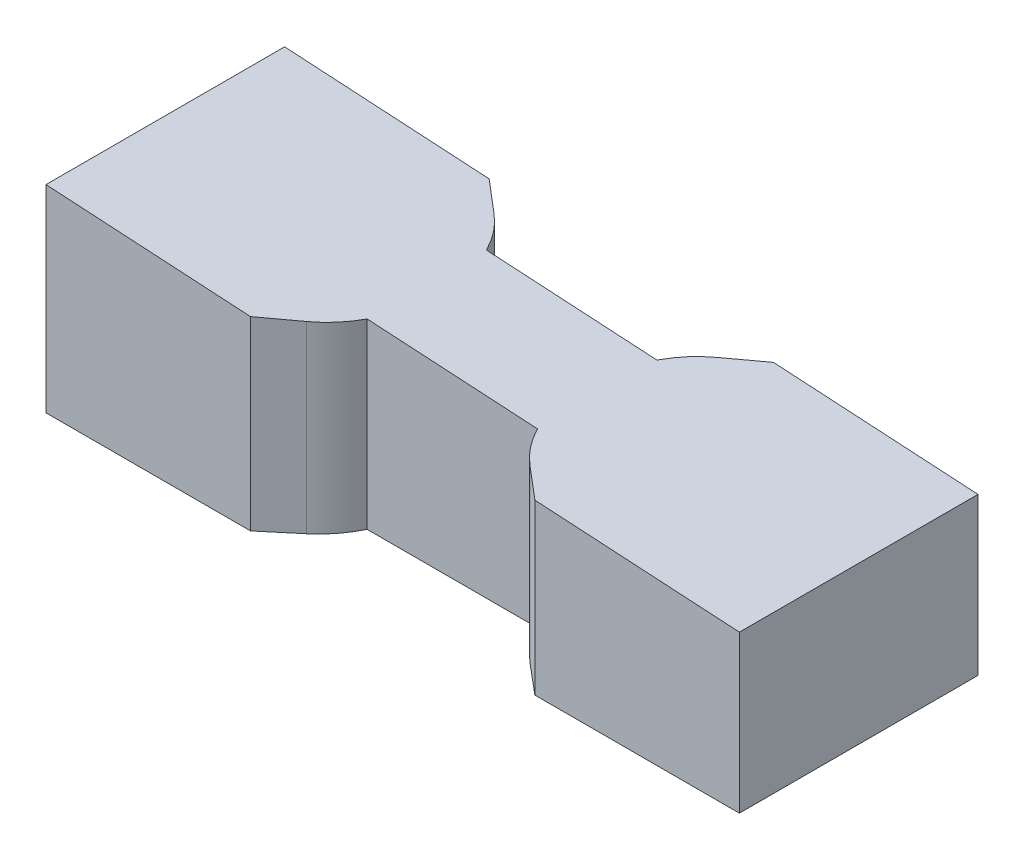
ISO-10303-21;
HEADER;
FILE_DESCRIPTION(('STEP AP214'),'2;1');
FILE_NAME('part.step','',(''),(''),'','','');
FILE_SCHEMA(('AUTOMOTIVE_DESIGN { 1 0 10303 214 1 1 1 1 }'));
ENDSEC;
DATA;
#1=APPLICATION_CONTEXT('core data for automotive mechanical design processes');
#2=APPLICATION_PROTOCOL_DEFINITION('international standard','automotive_design',2000,#1);
#3=PRODUCT_CONTEXT('',#1,'mechanical');
#4=PRODUCT('Part','Part','',(#3));
#5=PRODUCT_RELATED_PRODUCT_CATEGORY('part','',(#4));
#6=PRODUCT_DEFINITION_FORMATION('','',#4);
#7=PRODUCT_DEFINITION_CONTEXT('part definition',#1,'design');
#8=PRODUCT_DEFINITION('design','',#6,#7);
#9=PRODUCT_DEFINITION_SHAPE('','',#8);
#10=(LENGTH_UNIT() NAMED_UNIT(*) SI_UNIT(.MILLI.,.METRE.));
#11=(NAMED_UNIT(*) PLANE_ANGLE_UNIT() SI_UNIT($,.RADIAN.));
#12=(NAMED_UNIT(*) SI_UNIT($,.STERADIAN.) SOLID_ANGLE_UNIT());
#13=UNCERTAINTY_MEASURE_WITH_UNIT(LENGTH_MEASURE(1.E-05),#10,'distance_accuracy_value','');
#14=(GEOMETRIC_REPRESENTATION_CONTEXT(3) GLOBAL_UNCERTAINTY_ASSIGNED_CONTEXT((#13)) GLOBAL_UNIT_ASSIGNED_CONTEXT((#10,
#11,#12)) REPRESENTATION_CONTEXT('',''));
#15=CARTESIAN_POINT('',(0.,0.,0.));
#16=DIRECTION('',(0.,0.,1.));
#17=DIRECTION('',(1.,0.,0.));
#18=AXIS2_PLACEMENT_3D('',#15,#16,#17);
#19=CARTESIAN_POINT('',(-5.20386382712178,20.4591771710695,-0.450338350037831));
#20=DIRECTION('',(0.,-1.,0.));
#21=DIRECTION('',(0.,0.,-1.));
#22=AXIS2_PLACEMENT_3D('',#19,#20,#21);
#23=CYLINDRICAL_SURFACE('',#22,3.00000000000001);
#24=DIRECTION('',(0.,-1.,0.));
#25=VECTOR('',#24,1.);
#26=CARTESIAN_POINT('',(-3.27550099806217,8.,-2.74847167939477));
#27=LINE('',#26,#25);
#28=CARTESIAN_POINT('',(-3.27550099806215,5.3932232834846,-2.74847167939475));
#29=VERTEX_POINT('',#28);
#30=CARTESIAN_POINT('',(-3.27550099806215,0.,-2.74847167939476));
#31=VERTEX_POINT('',#30);
#32=EDGE_CURVE('E179',#29,#31,#27,.T.);
#33=ORIENTED_EDGE('',*,*,#32,.F.);
#34=CARTESIAN_POINT('',(-5.20386382712178,5.50697827785065,-0.450338350037831));
#35=DIRECTION('',(-0.0588880791734356,-0.998264591243856,0.));
#36=DIRECTION('',(0.998264591243856,-0.0588880791734356,0.));
#37=AXIS2_PLACEMENT_3D('',#34,#35,#36);
#38=ELLIPSE('',#37,3.00521527690564,3.00000000000001);
#39=CARTESIAN_POINT('',(-2.5,5.3474761292997,-1.75));
#40=VERTEX_POINT('',#39);
#41=EDGE_CURVE('E454',#29,#40,#38,.T.);
#42=ORIENTED_EDGE('',*,*,#41,.T.);
#43=DIRECTION('',(0.,-1.,0.));
#44=VECTOR('',#43,1.);
#45=CARTESIAN_POINT('',(-2.5,20.4591771710695,-1.75));
#46=LINE('',#45,#44);
#47=CARTESIAN_POINT('',(-2.5,0.,-1.75));
#48=VERTEX_POINT('',#47);
#49=EDGE_CURVE('E192',#40,#48,#46,.T.);
#50=ORIENTED_EDGE('',*,*,#49,.T.);
#51=CARTESIAN_POINT('',(-5.20386382712178,0.,-0.450338350037831));
#52=DIRECTION('',(0.,1.,0.));
#53=DIRECTION('',(0.,0.,1.));
#54=AXIS2_PLACEMENT_3D('',#51,#52,#53);
#55=CIRCLE('',#54,3.00000000000001);
#56=EDGE_CURVE('E181',#48,#31,#55,.T.);
#57=ORIENTED_EDGE('',*,*,#56,.T.);
#58=EDGE_LOOP('',(#33,#42,#50,#57));
#59=FACE_BOUND('',#58,.T.);
#60=ADVANCED_FACE('F36',(#59),#23,.T.);
#61=CARTESIAN_POINT('',(4.17113757407974,8.,-3.5));
#62=DIRECTION('',(0.,0.,1.));
#63=DIRECTION('',(1.,0.,0.));
#64=AXIS2_PLACEMENT_3D('',#61,#62,#63);
#65=PLANE('',#64);
#66=DIRECTION('',(0.,-1.,0.));
#67=VECTOR('',#66,1.);
#68=CARTESIAN_POINT('',(4.17113757407974,8.,-3.5));
#69=LINE('',#68,#67);
#70=CARTESIAN_POINT('',(4.17113757407974,4.95394271031928,-3.5));
#71=VERTEX_POINT('',#70);
#72=CARTESIAN_POINT('',(4.17113757407974,0.,-3.5));
#73=VERTEX_POINT('',#72);
#74=EDGE_CURVE('E44',#71,#73,#69,.T.);
#75=ORIENTED_EDGE('',*,*,#74,.F.);
#76=DIRECTION('',(0.998264591243856,-0.0588880791734356,0.));
#77=VECTOR('',#76,1.);
#78=CARTESIAN_POINT('',(10.1711375740797,4.6,-3.5));
#79=LINE('',#78,#77);
#80=CARTESIAN_POINT('',(10.1711375740797,4.6,-3.5));
#81=VERTEX_POINT('',#80);
#82=EDGE_CURVE('E164',#71,#81,#79,.T.);
#83=ORIENTED_EDGE('',*,*,#82,.T.);
#84=DIRECTION('',(0.,-1.,0.));
#85=VECTOR('',#84,1.);
#86=CARTESIAN_POINT('',(10.1711375740797,8.,-3.5));
#87=LINE('',#86,#85);
#88=CARTESIAN_POINT('',(10.1711375740797,0.,-3.5));
#89=VERTEX_POINT('',#88);
#90=EDGE_CURVE('E217',#81,#89,#87,.T.);
#91=ORIENTED_EDGE('',*,*,#90,.T.);
#92=DIRECTION('',(-1.,0.,0.));
#93=VECTOR('',#92,1.);
#94=CARTESIAN_POINT('',(4.17113757407974,0.,-3.5));
#95=LINE('',#94,#93);
#96=EDGE_CURVE('E196',#89,#73,#95,.T.);
#97=ORIENTED_EDGE('',*,*,#96,.T.);
#98=EDGE_LOOP('',(#75,#83,#91,#97));
#99=FACE_BOUND('',#98,.T.);
#100=ADVANCED_FACE('F38',(#99),#65,.F.);
#101=CARTESIAN_POINT('',(3.27550099806217,8.,-2.74847167939477));
#102=DIRECTION('',(0.642787609686541,0.,0.766044443118977));
#103=DIRECTION('',(0.766044443118977,0.,-0.642787609686541));
#104=AXIS2_PLACEMENT_3D('',#101,#102,#103);
#105=PLANE('',#104);
#106=DIRECTION('',(0.,-1.,0.));
#107=VECTOR('',#106,1.);
#108=CARTESIAN_POINT('',(3.27550099806217,8.,-2.74847167939477));
#109=LINE('',#108,#107);
#110=CARTESIAN_POINT('',(3.27550099806217,5.0067767165154,-2.74847167939477));
#111=VERTEX_POINT('',#110);
#112=CARTESIAN_POINT('',(3.27550099806217,0.,-2.74847167939477));
#113=VERTEX_POINT('',#112);
#114=EDGE_CURVE('E229',#111,#113,#109,.T.);
#115=ORIENTED_EDGE('',*,*,#114,.F.);
#116=DIRECTION('',(0.765263479463064,-0.0451432383382526,-0.642132303370902));
#117=VECTOR('',#116,1.);
#118=CARTESIAN_POINT('',(3.17209569477223,5.0128766420667,-2.66170432754241));
#119=LINE('',#118,#117);
#120=EDGE_CURVE('E237',#111,#71,#119,.T.);
#121=ORIENTED_EDGE('',*,*,#120,.T.);
#122=ORIENTED_EDGE('',*,*,#74,.T.);
#123=DIRECTION('',(-0.766044443118977,0.,0.642787609686541));
#124=VECTOR('',#123,1.);
#125=CARTESIAN_POINT('',(3.27550099806217,0.,-2.74847167939477));
#126=LINE('',#125,#124);
#127=EDGE_CURVE('E199',#73,#113,#126,.T.);
#128=ORIENTED_EDGE('',*,*,#127,.T.);
#129=EDGE_LOOP('',(#115,#121,#122,#128));
#130=FACE_BOUND('',#129,.T.);
#131=ADVANCED_FACE('F235',(#130),#105,.F.);
#132=CARTESIAN_POINT('',(5.20386382712179,8.,-0.450338350037831));
#133=DIRECTION('',(0.,-1.,0.));
#134=DIRECTION('',(0.,0.,-1.));
#135=AXIS2_PLACEMENT_3D('',#132,#133,#134);
#136=CYLINDRICAL_SURFACE('',#135,3.00000000000001);
#137=DIRECTION('',(0.,-1.,0.));
#138=VECTOR('',#137,1.);
#139=CARTESIAN_POINT('',(2.5,8.,-1.75));
#140=LINE('',#139,#138);
#141=CARTESIAN_POINT('',(2.5,5.0525238707003,-1.75));
#142=VERTEX_POINT('',#141);
#143=CARTESIAN_POINT('',(2.5,0.,-1.75));
#144=VERTEX_POINT('',#143);
#145=EDGE_CURVE('E227',#142,#144,#140,.T.);
#146=ORIENTED_EDGE('',*,*,#145,.F.);
#147=CARTESIAN_POINT('',(5.20386382712179,4.89302172214935,-0.450338350037831));
#148=DIRECTION('',(-0.0588880791734356,-0.998264591243856,0.));
#149=DIRECTION('',(0.998264591243856,-0.0588880791734356,0.));
#150=AXIS2_PLACEMENT_3D('',#147,#148,#149);
#151=ELLIPSE('',#150,3.00521527690564,3.00000000000001);
#152=EDGE_CURVE('E448',#142,#111,#151,.T.);
#153=ORIENTED_EDGE('',*,*,#152,.T.);
#154=ORIENTED_EDGE('',*,*,#114,.T.);
#155=CARTESIAN_POINT('',(5.20386382712179,0.,-0.450338350037831));
#156=DIRECTION('',(0.,1.,0.));
#157=DIRECTION('',(0.,0.,1.));
#158=AXIS2_PLACEMENT_3D('',#155,#156,#157);
#159=CIRCLE('',#158,3.00000000000001);
#160=EDGE_CURVE('E202',#113,#144,#159,.T.);
#161=ORIENTED_EDGE('',*,*,#160,.T.);
#162=EDGE_LOOP('',(#146,#153,#154,#161));
#163=FACE_BOUND('',#162,.T.);
#164=ADVANCED_FACE('F305',(#163),#136,.T.);
#165=CARTESIAN_POINT('',(5.20386382712179,8.,0.450338350037832));
#166=DIRECTION('',(0.,-1.,0.));
#167=DIRECTION('',(0.,0.,-1.));
#168=AXIS2_PLACEMENT_3D('',#165,#166,#167);
#169=CYLINDRICAL_SURFACE('',#168,3.00000000000001);
#170=DIRECTION('',(0.,-1.,0.));
#171=VECTOR('',#170,1.);
#172=CARTESIAN_POINT('',(3.27550099806217,8.,2.74847167939477));
#173=LINE('',#172,#171);
#174=CARTESIAN_POINT('',(3.27550099806217,5.0067767165154,2.74847167939477));
#175=VERTEX_POINT('',#174);
#176=CARTESIAN_POINT('',(3.27550099806217,0.,2.74847167939477));
#177=VERTEX_POINT('',#176);
#178=EDGE_CURVE('E223',#175,#177,#173,.T.);
#179=ORIENTED_EDGE('',*,*,#178,.F.);
#180=CARTESIAN_POINT('',(5.20386382712179,4.89302172214935,0.450338350037832));
#181=DIRECTION('',(-0.0588880791734356,-0.998264591243856,0.));
#182=DIRECTION('',(0.998264591243856,-0.0588880791734356,0.));
#183=AXIS2_PLACEMENT_3D('',#180,#181,#182);
#184=ELLIPSE('',#183,3.00521527690564,3.00000000000001);
#185=CARTESIAN_POINT('',(2.5,5.0525238707003,1.75));
#186=VERTEX_POINT('',#185);
#187=EDGE_CURVE('E461',#175,#186,#184,.T.);
#188=ORIENTED_EDGE('',*,*,#187,.T.);
#189=DIRECTION('',(0.,-1.,0.));
#190=VECTOR('',#189,1.);
#191=CARTESIAN_POINT('',(2.5,8.,1.75));
#192=LINE('',#191,#190);
#193=CARTESIAN_POINT('',(2.5,0.,1.75));
#194=VERTEX_POINT('',#193);
#195=EDGE_CURVE('E225',#186,#194,#192,.T.);
#196=ORIENTED_EDGE('',*,*,#195,.T.);
#197=CARTESIAN_POINT('',(5.20386382712179,0.,0.450338350037832));
#198=DIRECTION('',(0.,1.,0.));
#199=DIRECTION('',(0.,0.,-1.));
#200=AXIS2_PLACEMENT_3D('',#197,#198,#199);
#201=CIRCLE('',#200,3.00000000000001);
#202=EDGE_CURVE('E205',#194,#177,#201,.T.);
#203=ORIENTED_EDGE('',*,*,#202,.T.);
#204=EDGE_LOOP('',(#179,#188,#196,#203));
#205=FACE_BOUND('',#204,.T.);
#206=ADVANCED_FACE('F264',(#205),#169,.T.);
#207=CARTESIAN_POINT('',(3.27550099806217,8.,2.74847167939477));
#208=DIRECTION('',(0.642787609686541,0.,-0.766044443118976));
#209=DIRECTION('',(-0.766044443118977,0.,-0.642787609686541));
#210=AXIS2_PLACEMENT_3D('',#207,#208,#209);
#211=PLANE('',#210);
#212=DIRECTION('',(0.,-1.,0.));
#213=VECTOR('',#212,1.);
#214=CARTESIAN_POINT('',(4.17113757407974,8.,3.5));
#215=LINE('',#214,#213);
#216=CARTESIAN_POINT('',(4.17113757407974,4.95394271031928,3.5));
#217=VERTEX_POINT('',#216);
#218=CARTESIAN_POINT('',(4.17113757407974,0.,3.5));
#219=VERTEX_POINT('',#218);
#220=EDGE_CURVE('E221',#217,#219,#215,.T.);
#221=ORIENTED_EDGE('',*,*,#220,.F.);
#222=DIRECTION('',(-0.765263479463064,0.0451432383382526,-0.642132303370902));
#223=VECTOR('',#222,1.);
#224=CARTESIAN_POINT('',(3.17209569477223,5.0128766420667,2.66170432754241));
#225=LINE('',#224,#223);
#226=EDGE_CURVE('E261',#217,#175,#225,.T.);
#227=ORIENTED_EDGE('',*,*,#226,.T.);
#228=ORIENTED_EDGE('',*,*,#178,.T.);
#229=DIRECTION('',(0.766044443118976,0.,0.642787609686541));
#230=VECTOR('',#229,1.);
#231=CARTESIAN_POINT('',(3.27550099806217,0.,2.74847167939477));
#232=LINE('',#231,#230);
#233=EDGE_CURVE('E208',#177,#219,#232,.T.);
#234=ORIENTED_EDGE('',*,*,#233,.T.);
#235=EDGE_LOOP('',(#221,#227,#228,#234));
#236=FACE_BOUND('',#235,.T.);
#237=ADVANCED_FACE('F259',(#236),#211,.F.);
#238=CARTESIAN_POINT('',(4.17113757407974,8.,3.5));
#239=DIRECTION('',(0.,0.,-1.));
#240=DIRECTION('',(-1.,0.,0.));
#241=AXIS2_PLACEMENT_3D('',#238,#239,#240);
#242=PLANE('',#241);
#243=DIRECTION('',(0.,-1.,0.));
#244=VECTOR('',#243,1.);
#245=CARTESIAN_POINT('',(10.1711375740797,8.,3.5));
#246=LINE('',#245,#244);
#247=CARTESIAN_POINT('',(10.1711375740797,4.6,3.5));
#248=VERTEX_POINT('',#247);
#249=CARTESIAN_POINT('',(10.1711375740797,0.,3.5));
#250=VERTEX_POINT('',#249);
#251=EDGE_CURVE('E219',#248,#250,#246,.T.);
#252=ORIENTED_EDGE('',*,*,#251,.F.);
#253=DIRECTION('',(0.998264591243856,-0.0588880791734356,0.));
#254=VECTOR('',#253,1.);
#255=CARTESIAN_POINT('',(10.1711375740797,4.6,3.5));
#256=LINE('',#255,#254);
#257=EDGE_CURVE('E165',#217,#248,#256,.T.);
#258=ORIENTED_EDGE('',*,*,#257,.F.);
#259=ORIENTED_EDGE('',*,*,#220,.T.);
#260=DIRECTION('',(1.,0.,0.));
#261=VECTOR('',#260,1.);
#262=CARTESIAN_POINT('',(4.17113757407974,0.,3.5));
#263=LINE('',#262,#261);
#264=EDGE_CURVE('E211',#219,#250,#263,.T.);
#265=ORIENTED_EDGE('',*,*,#264,.T.);
#266=EDGE_LOOP('',(#252,#258,#259,#265));
#267=FACE_BOUND('',#266,.T.);
#268=ADVANCED_FACE('F254',(#267),#242,.F.);
#269=CARTESIAN_POINT('',(10.1711375740797,8.,-3.5));
#270=DIRECTION('',(-1.,0.,0.));
#271=DIRECTION('',(0.,0.,1.));
#272=AXIS2_PLACEMENT_3D('',#269,#270,#271);
#273=PLANE('',#272);
#274=ORIENTED_EDGE('',*,*,#90,.F.);
#275=DIRECTION('',(0.,0.,1.));
#276=VECTOR('',#275,1.);
#277=CARTESIAN_POINT('',(10.1711375740797,4.6,-3.5));
#278=LINE('',#277,#276);
#279=EDGE_CURVE('E155',#81,#248,#278,.T.);
#280=ORIENTED_EDGE('',*,*,#279,.T.);
#281=ORIENTED_EDGE('',*,*,#251,.T.);
#282=DIRECTION('',(0.,0.,-1.));
#283=VECTOR('',#282,1.);
#284=CARTESIAN_POINT('',(10.1711375740797,0.,-3.5));
#285=LINE('',#284,#283);
#286=EDGE_CURVE('E214',#250,#89,#285,.T.);
#287=ORIENTED_EDGE('',*,*,#286,.T.);
#288=EDGE_LOOP('',(#274,#280,#281,#287));
#289=FACE_BOUND('',#288,.T.);
#290=ADVANCED_FACE('F248',(#289),#273,.F.);
#291=CARTESIAN_POINT('',(5.20386382712179,0.,0.450338350037832));
#292=DIRECTION('',(0.,-1.,0.));
#293=DIRECTION('',(0.,0.,-1.));
#294=AXIS2_PLACEMENT_3D('',#291,#292,#293);
#295=PLANE('',#294);
#296=CARTESIAN_POINT('',(-5.20386382712178,0.,0.450338350037832));
#297=DIRECTION('',(0.,1.,0.));
#298=DIRECTION('',(0.,0.,-1.));
#299=AXIS2_PLACEMENT_3D('',#296,#297,#298);
#300=CIRCLE('',#299,3.00000000000001);
#301=CARTESIAN_POINT('',(-3.27550099806215,0.,2.74847167939476));
#302=VERTEX_POINT('',#301);
#303=CARTESIAN_POINT('',(-2.5,0.,1.75));
#304=VERTEX_POINT('',#303);
#305=EDGE_CURVE('E184',#302,#304,#300,.T.);
#306=ORIENTED_EDGE('',*,*,#305,.F.);
#307=DIRECTION('',(0.766044443118975,0.,-0.642787609686542));
#308=VECTOR('',#307,1.);
#309=CARTESIAN_POINT('',(-3.27550099806217,0.,2.74847167939477));
#310=LINE('',#309,#308);
#311=CARTESIAN_POINT('',(-4.17113757407974,0.,3.5));
#312=VERTEX_POINT('',#311);
#313=EDGE_CURVE('E435',#312,#302,#310,.T.);
#314=ORIENTED_EDGE('',*,*,#313,.F.);
#315=DIRECTION('',(1.,0.,0.));
#316=VECTOR('',#315,1.);
#317=CARTESIAN_POINT('',(-4.17113757407974,0.,3.5));
#318=LINE('',#317,#316);
#319=CARTESIAN_POINT('',(-10.1711375740797,0.,3.5));
#320=VERTEX_POINT('',#319);
#321=EDGE_CURVE('E436',#320,#312,#318,.T.);
#322=ORIENTED_EDGE('',*,*,#321,.F.);
#323=DIRECTION('',(0.,0.,1.));
#324=VECTOR('',#323,1.);
#325=CARTESIAN_POINT('',(-10.1711375740797,0.,-3.5));
#326=LINE('',#325,#324);
#327=CARTESIAN_POINT('',(-10.1711375740797,0.,-3.5));
#328=VERTEX_POINT('',#327);
#329=EDGE_CURVE('E169',#328,#320,#326,.T.);
#330=ORIENTED_EDGE('',*,*,#329,.F.);
#331=DIRECTION('',(-1.,0.,0.));
#332=VECTOR('',#331,1.);
#333=CARTESIAN_POINT('',(-4.17113757407974,0.,-3.5));
#334=LINE('',#333,#332);
#335=CARTESIAN_POINT('',(-4.17113757407974,0.,-3.5));
#336=VERTEX_POINT('',#335);
#337=EDGE_CURVE('E441',#336,#328,#334,.T.);
#338=ORIENTED_EDGE('',*,*,#337,.F.);
#339=DIRECTION('',(-0.766044443118976,0.,-0.642787609686542));
#340=VECTOR('',#339,1.);
#341=CARTESIAN_POINT('',(-3.27550099806217,0.,-2.74847167939477));
#342=LINE('',#341,#340);
#343=EDGE_CURVE('E444',#31,#336,#342,.T.);
#344=ORIENTED_EDGE('',*,*,#343,.F.);
#345=ORIENTED_EDGE('',*,*,#56,.F.);
#346=DIRECTION('',(-1.,0.,0.));
#347=VECTOR('',#346,1.);
#348=CARTESIAN_POINT('',(2.5,0.,-1.75));
#349=LINE('',#348,#347);
#350=EDGE_CURVE('E189',#144,#48,#349,.T.);
#351=ORIENTED_EDGE('',*,*,#350,.F.);
#352=ORIENTED_EDGE('',*,*,#160,.F.);
#353=ORIENTED_EDGE('',*,*,#127,.F.);
#354=ORIENTED_EDGE('',*,*,#96,.F.);
#355=ORIENTED_EDGE('',*,*,#286,.F.);
#356=ORIENTED_EDGE('',*,*,#264,.F.);
#357=ORIENTED_EDGE('',*,*,#233,.F.);
#358=ORIENTED_EDGE('',*,*,#202,.F.);
#359=DIRECTION('',(1.,0.,0.));
#360=VECTOR('',#359,1.);
#361=CARTESIAN_POINT('',(2.5,0.,1.75));
#362=LINE('',#361,#360);
#363=EDGE_CURVE('E186',#304,#194,#362,.T.);
#364=ORIENTED_EDGE('',*,*,#363,.F.);
#365=EDGE_LOOP('',(#306,#314,#322,#330,#338,#344,#345,#351,#352,#353,#354,#355,#356,#357,#358,#364));
#366=FACE_BOUND('',#365,.T.);
#367=ADVANCED_FACE('F242',(#366),#295,.T.);
#368=CARTESIAN_POINT('',(2.5,20.4591771710695,-1.75));
#369=DIRECTION('',(0.,0.,1.));
#370=DIRECTION('',(1.,0.,0.));
#371=AXIS2_PLACEMENT_3D('',#368,#369,#370);
#372=PLANE('',#371);
#373=ORIENTED_EDGE('',*,*,#49,.F.);
#374=DIRECTION('',(0.998264591243856,-0.0588880791734356,0.));
#375=VECTOR('',#374,1.);
#376=CARTESIAN_POINT('',(1.59430626186222,5.10595115343291,-1.75));
#377=LINE('',#376,#375);
#378=EDGE_CURVE('E451',#40,#142,#377,.T.);
#379=ORIENTED_EDGE('',*,*,#378,.T.);
#380=ORIENTED_EDGE('',*,*,#145,.T.);
#381=ORIENTED_EDGE('',*,*,#350,.T.);
#382=EDGE_LOOP('',(#373,#379,#380,#381));
#383=FACE_BOUND('',#382,.T.);
#384=ADVANCED_FACE('F285',(#383),#372,.F.);
#385=CARTESIAN_POINT('',(2.5,20.4591771710695,1.75));
#386=DIRECTION('',(0.,0.,-1.));
#387=DIRECTION('',(-1.,0.,0.));
#388=AXIS2_PLACEMENT_3D('',#385,#386,#387);
#389=PLANE('',#388);
#390=ORIENTED_EDGE('',*,*,#195,.F.);
#391=DIRECTION('',(-0.998264591243856,0.0588880791734356,0.));
#392=VECTOR('',#391,1.);
#393=CARTESIAN_POINT('',(1.59430626186222,5.10595115343291,1.75));
#394=LINE('',#393,#392);
#395=CARTESIAN_POINT('',(-2.5,5.3474761292997,1.75));
#396=VERTEX_POINT('',#395);
#397=EDGE_CURVE('E273',#186,#396,#394,.T.);
#398=ORIENTED_EDGE('',*,*,#397,.T.);
#399=DIRECTION('',(0.,-1.,0.));
#400=VECTOR('',#399,1.);
#401=CARTESIAN_POINT('',(-2.5,20.4591771710695,1.75));
#402=LINE('',#401,#400);
#403=EDGE_CURVE('E194',#396,#304,#402,.T.);
#404=ORIENTED_EDGE('',*,*,#403,.T.);
#405=ORIENTED_EDGE('',*,*,#363,.T.);
#406=EDGE_LOOP('',(#390,#398,#404,#405));
#407=FACE_BOUND('',#406,.T.);
#408=ADVANCED_FACE('F270',(#407),#389,.F.);
#409=CARTESIAN_POINT('',(-5.20386382712178,20.4591771710695,0.450338350037832));
#410=DIRECTION('',(0.,-1.,0.));
#411=DIRECTION('',(0.,0.,-1.));
#412=AXIS2_PLACEMENT_3D('',#409,#410,#411);
#413=CYLINDRICAL_SURFACE('',#412,3.00000000000001);
#414=ORIENTED_EDGE('',*,*,#403,.F.);
#415=CARTESIAN_POINT('',(-5.20386382712178,5.50697827785065,0.450338350037832));
#416=DIRECTION('',(-0.0588880791734356,-0.998264591243856,0.));
#417=DIRECTION('',(0.998264591243856,-0.0588880791734356,0.));
#418=AXIS2_PLACEMENT_3D('',#415,#416,#417);
#419=ELLIPSE('',#418,3.00521527690565,3.00000000000001);
#420=CARTESIAN_POINT('',(-3.27550099806215,5.3932232834846,2.74847167939475));
#421=VERTEX_POINT('',#420);
#422=EDGE_CURVE('E464',#396,#421,#419,.T.);
#423=ORIENTED_EDGE('',*,*,#422,.T.);
#424=DIRECTION('',(0.,-1.,0.));
#425=VECTOR('',#424,1.);
#426=CARTESIAN_POINT('',(-3.27550099806217,8.,2.74847167939477));
#427=LINE('',#426,#425);
#428=EDGE_CURVE('E58',#421,#302,#427,.T.);
#429=ORIENTED_EDGE('',*,*,#428,.T.);
#430=ORIENTED_EDGE('',*,*,#305,.T.);
#431=EDGE_LOOP('',(#414,#423,#429,#430));
#432=FACE_BOUND('',#431,.T.);
#433=ADVANCED_FACE('F274',(#432),#413,.T.);
#434=CARTESIAN_POINT('',(-3.27550099806217,8.,-2.74847167939477));
#435=DIRECTION('',(-0.642787609686542,0.,0.766044443118976));
#436=DIRECTION('',(0.766044443118976,0.,0.642787609686542));
#437=AXIS2_PLACEMENT_3D('',#434,#435,#436);
#438=PLANE('',#437);
#439=DIRECTION('',(0.,-1.,0.));
#440=VECTOR('',#439,1.);
#441=CARTESIAN_POINT('',(-4.17113757407974,8.,-3.5));
#442=LINE('',#441,#440);
#443=CARTESIAN_POINT('',(-4.17113757407974,5.44605728968072,-3.5));
#444=VERTEX_POINT('',#443);
#445=EDGE_CURVE('E173',#444,#336,#442,.T.);
#446=ORIENTED_EDGE('',*,*,#445,.F.);
#447=DIRECTION('',(0.765263479463063,-0.0451432383382526,0.642132303370903));
#448=VECTOR('',#447,1.);
#449=CARTESIAN_POINT('',(-3.36555593598402,5.39853566495222,-2.82403674459068));
#450=LINE('',#449,#448);
#451=EDGE_CURVE('E457',#444,#29,#450,.T.);
#452=ORIENTED_EDGE('',*,*,#451,.T.);
#453=ORIENTED_EDGE('',*,*,#32,.T.);
#454=ORIENTED_EDGE('',*,*,#343,.T.);
#455=EDGE_LOOP('',(#446,#452,#453,#454));
#456=FACE_BOUND('',#455,.T.);
#457=ADVANCED_FACE('F276',(#456),#438,.F.);
#458=CARTESIAN_POINT('',(-4.17113757407974,8.,-3.5));
#459=DIRECTION('',(0.,0.,1.));
#460=DIRECTION('',(1.,0.,0.));
#461=AXIS2_PLACEMENT_3D('',#458,#459,#460);
#462=PLANE('',#461);
#463=DIRECTION('',(0.,-1.,0.));
#464=VECTOR('',#463,1.);
#465=CARTESIAN_POINT('',(-10.1711375740797,8.,-3.5));
#466=LINE('',#465,#464);
#467=CARTESIAN_POINT('',(-10.1711375740797,5.8,-3.5));
#468=VERTEX_POINT('',#467);
#469=EDGE_CURVE('E171',#468,#328,#466,.T.);
#470=ORIENTED_EDGE('',*,*,#469,.F.);
#471=EDGE_CURVE('E151',#468,#444,#79,.T.);
#472=ORIENTED_EDGE('',*,*,#471,.T.);
#473=ORIENTED_EDGE('',*,*,#445,.T.);
#474=ORIENTED_EDGE('',*,*,#337,.T.);
#475=EDGE_LOOP('',(#470,#472,#473,#474));
#476=FACE_BOUND('',#475,.T.);
#477=ADVANCED_FACE('F282',(#476),#462,.F.);
#478=CARTESIAN_POINT('',(-10.1711375740797,8.,-3.5));
#479=DIRECTION('',(1.,0.,0.));
#480=DIRECTION('',(0.,0.,-1.));
#481=AXIS2_PLACEMENT_3D('',#478,#479,#480);
#482=PLANE('',#481);
#483=DIRECTION('',(0.,-1.,0.));
#484=VECTOR('',#483,1.);
#485=CARTESIAN_POINT('',(-10.1711375740797,8.,3.5));
#486=LINE('',#485,#484);
#487=CARTESIAN_POINT('',(-10.1711375740797,5.8,3.5));
#488=VERTEX_POINT('',#487);
#489=EDGE_CURVE('E161',#488,#320,#486,.T.);
#490=ORIENTED_EDGE('',*,*,#489,.F.);
#491=DIRECTION('',(0.,0.,1.));
#492=VECTOR('',#491,1.);
#493=CARTESIAN_POINT('',(-10.1711375740797,5.8,-3.5));
#494=LINE('',#493,#492);
#495=EDGE_CURVE('E148',#468,#488,#494,.T.);
#496=ORIENTED_EDGE('',*,*,#495,.F.);
#497=ORIENTED_EDGE('',*,*,#469,.T.);
#498=ORIENTED_EDGE('',*,*,#329,.T.);
#499=EDGE_LOOP('',(#490,#496,#497,#498));
#500=FACE_BOUND('',#499,.T.);
#501=ADVANCED_FACE('F167',(#500),#482,.F.);
#502=CARTESIAN_POINT('',(-4.17113757407974,8.,3.5));
#503=DIRECTION('',(0.,0.,-1.));
#504=DIRECTION('',(-1.,0.,0.));
#505=AXIS2_PLACEMENT_3D('',#502,#503,#504);
#506=PLANE('',#505);
#507=DIRECTION('',(0.,-1.,0.));
#508=VECTOR('',#507,1.);
#509=CARTESIAN_POINT('',(-4.17113757407974,8.,3.5));
#510=LINE('',#509,#508);
#511=CARTESIAN_POINT('',(-4.17113757407974,5.44605728968072,3.5));
#512=VERTEX_POINT('',#511);
#513=EDGE_CURVE('E163',#512,#312,#510,.T.);
#514=ORIENTED_EDGE('',*,*,#513,.F.);
#515=EDGE_CURVE('E51',#488,#512,#256,.T.);
#516=ORIENTED_EDGE('',*,*,#515,.F.);
#517=ORIENTED_EDGE('',*,*,#489,.T.);
#518=ORIENTED_EDGE('',*,*,#321,.T.);
#519=EDGE_LOOP('',(#514,#516,#517,#518));
#520=FACE_BOUND('',#519,.T.);
#521=ADVANCED_FACE('F159',(#520),#506,.F.);
#522=CARTESIAN_POINT('',(-3.27550099806217,8.,2.74847167939477));
#523=DIRECTION('',(-0.642787609686542,0.,-0.766044443118975));
#524=DIRECTION('',(-0.766044443118975,0.,0.642787609686542));
#525=AXIS2_PLACEMENT_3D('',#522,#523,#524);
#526=PLANE('',#525);
#527=ORIENTED_EDGE('',*,*,#428,.F.);
#528=DIRECTION('',(-0.765263479463063,0.0451432383382526,0.642132303370903));
#529=VECTOR('',#528,1.);
#530=CARTESIAN_POINT('',(-3.36555593598402,5.39853566495222,2.82403674459068));
#531=LINE('',#530,#529);
#532=EDGE_CURVE('E11',#421,#512,#531,.T.);
#533=ORIENTED_EDGE('',*,*,#532,.T.);
#534=ORIENTED_EDGE('',*,*,#513,.T.);
#535=ORIENTED_EDGE('',*,*,#313,.T.);
#536=EDGE_LOOP('',(#527,#533,#534,#535));
#537=FACE_BOUND('',#536,.T.);
#538=ADVANCED_FACE('F386',(#537),#526,.F.);
#539=CARTESIAN_POINT('',(10.1711375740797,4.6,-3.5));
#540=DIRECTION('',(-0.0588880791734356,-0.998264591243856,0.));
#541=DIRECTION('',(0.998264591243856,-0.0588880791734356,0.));
#542=AXIS2_PLACEMENT_3D('',#539,#540,#541);
#543=PLANE('',#542);
#544=ORIENTED_EDGE('',*,*,#152,.F.);
#545=ORIENTED_EDGE('',*,*,#378,.F.);
#546=ORIENTED_EDGE('',*,*,#41,.F.);
#547=ORIENTED_EDGE('',*,*,#451,.F.);
#548=ORIENTED_EDGE('',*,*,#471,.F.);
#549=ORIENTED_EDGE('',*,*,#495,.T.);
#550=ORIENTED_EDGE('',*,*,#515,.T.);
#551=ORIENTED_EDGE('',*,*,#532,.F.);
#552=ORIENTED_EDGE('',*,*,#422,.F.);
#553=ORIENTED_EDGE('',*,*,#397,.F.);
#554=ORIENTED_EDGE('',*,*,#187,.F.);
#555=ORIENTED_EDGE('',*,*,#226,.F.);
#556=ORIENTED_EDGE('',*,*,#257,.T.);
#557=ORIENTED_EDGE('',*,*,#279,.F.);
#558=ORIENTED_EDGE('',*,*,#82,.F.);
#559=ORIENTED_EDGE('',*,*,#120,.F.);
#560=EDGE_LOOP('',(#544,#545,#546,#547,#548,#549,#550,#551,#552,#553,#554,#555,#556,#557,#558,#559));
#561=FACE_BOUND('',#560,.T.);
#562=ADVANCED_FACE('F149',(#561),#543,.F.);
#563=CLOSED_SHELL('',(#60,#100,#131,#164,#206,#237,#268,#290,#367,#384,#408,#433,#457,#477,#501,
#521,#538,#562));
#564=MANIFOLD_SOLID_BREP('B2',#563);
#565=ADVANCED_BREP_SHAPE_REPRESENTATION('',(#18,#564),#14);
#566=SHAPE_DEFINITION_REPRESENTATION(#9,#565);
ENDSEC;
END-ISO-10303-21;
